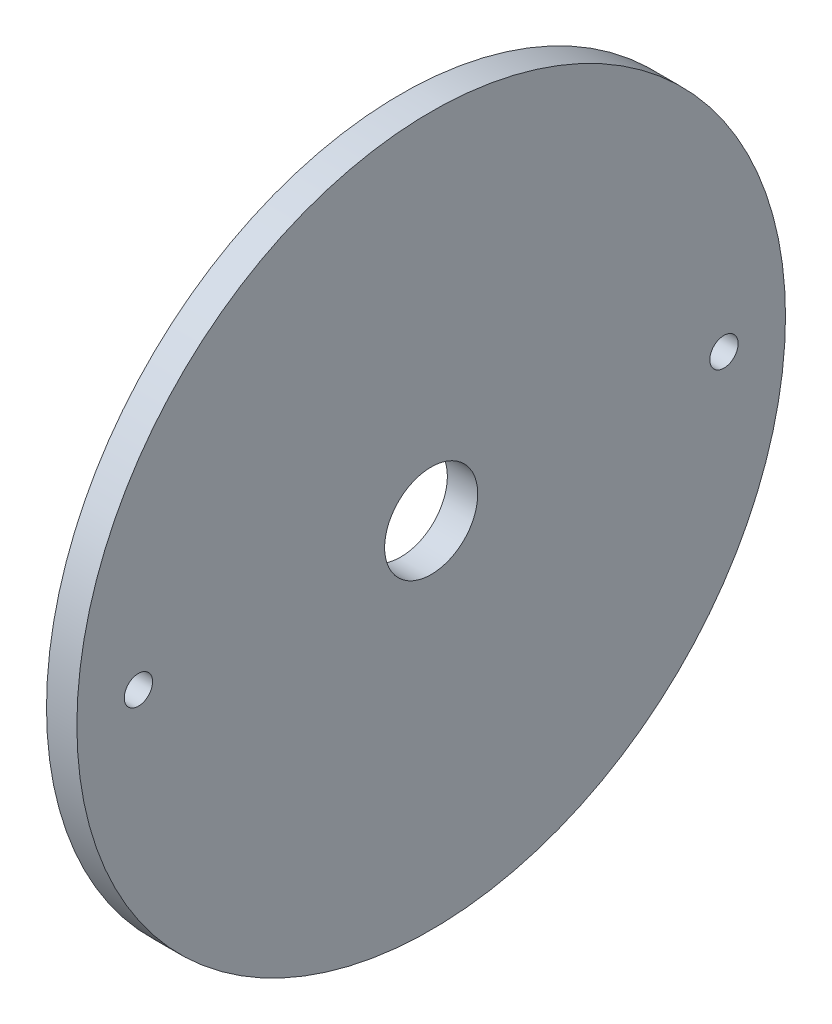
ISO-10303-21;
HEADER;
FILE_DESCRIPTION(('STEP AP214'),'2;1');
FILE_NAME('part.step','',(''),(''),'','','');
FILE_SCHEMA(('AUTOMOTIVE_DESIGN { 1 0 10303 214 1 1 1 1 }'));
ENDSEC;
DATA;
#1=APPLICATION_CONTEXT('core data for automotive mechanical design processes');
#2=APPLICATION_PROTOCOL_DEFINITION('international standard','automotive_design',2000,#1);
#3=PRODUCT_CONTEXT('',#1,'mechanical');
#4=PRODUCT('Part','Part','',(#3));
#5=PRODUCT_RELATED_PRODUCT_CATEGORY('part','',(#4));
#6=PRODUCT_DEFINITION_FORMATION('','',#4);
#7=PRODUCT_DEFINITION_CONTEXT('part definition',#1,'design');
#8=PRODUCT_DEFINITION('design','',#6,#7);
#9=PRODUCT_DEFINITION_SHAPE('','',#8);
#10=(LENGTH_UNIT() NAMED_UNIT(*) SI_UNIT(.MILLI.,.METRE.));
#11=(NAMED_UNIT(*) PLANE_ANGLE_UNIT() SI_UNIT($,.RADIAN.));
#12=(NAMED_UNIT(*) SI_UNIT($,.STERADIAN.) SOLID_ANGLE_UNIT());
#13=UNCERTAINTY_MEASURE_WITH_UNIT(LENGTH_MEASURE(1.E-05),#10,'distance_accuracy_value','');
#14=(GEOMETRIC_REPRESENTATION_CONTEXT(3) GLOBAL_UNCERTAINTY_ASSIGNED_CONTEXT((#13)) GLOBAL_UNIT_ASSIGNED_CONTEXT((#10,
#11,#12)) REPRESENTATION_CONTEXT('',''));
#15=CARTESIAN_POINT('',(0.,0.,0.));
#16=DIRECTION('',(0.,0.,1.));
#17=DIRECTION('',(1.,0.,0.));
#18=AXIS2_PLACEMENT_3D('',#15,#16,#17);
#19=CARTESIAN_POINT('',(1.5,0.,0.));
#20=DIRECTION('',(1.,0.,0.));
#21=DIRECTION('',(0.,0.,-1.));
#22=AXIS2_PLACEMENT_3D('',#19,#20,#21);
#23=PLANE('',#22);
#24=CARTESIAN_POINT('',(1.5,0.,-14.46));
#25=DIRECTION('',(1.,0.,0.));
#26=DIRECTION('',(0.,0.,-1.));
#27=AXIS2_PLACEMENT_3D('',#24,#25,#26);
#28=CIRCLE('',#27,0.7);
#29=CARTESIAN_POINT('',(1.5,0.,-15.16));
#30=VERTEX_POINT('',#29);
#31=EDGE_CURVE('E46',#30,#30,#28,.T.);
#32=ORIENTED_EDGE('',*,*,#31,.F.);
#33=EDGE_LOOP('',(#32));
#34=FACE_BOUND('',#33,.T.);
#35=CARTESIAN_POINT('',(1.5,0.,0.));
#36=DIRECTION('',(1.,0.,0.));
#37=DIRECTION('',(0.,0.,-1.));
#38=AXIS2_PLACEMENT_3D('',#35,#36,#37);
#39=CIRCLE('',#38,17.5);
#40=CARTESIAN_POINT('',(1.5,0.,-17.5));
#41=VERTEX_POINT('',#40);
#42=EDGE_CURVE('E10',#41,#41,#39,.T.);
#43=ORIENTED_EDGE('',*,*,#42,.T.);
#44=EDGE_LOOP('',(#43));
#45=FACE_BOUND('',#44,.T.);
#46=CARTESIAN_POINT('',(1.5,0.,0.));
#47=DIRECTION('',(1.,0.,0.));
#48=DIRECTION('',(0.,0.,-1.));
#49=AXIS2_PLACEMENT_3D('',#46,#47,#48);
#50=CIRCLE('',#49,2.3);
#51=CARTESIAN_POINT('',(1.5,0.,-2.3));
#52=VERTEX_POINT('',#51);
#53=EDGE_CURVE('E41',#52,#52,#50,.T.);
#54=ORIENTED_EDGE('',*,*,#53,.F.);
#55=EDGE_LOOP('',(#54));
#56=FACE_BOUND('',#55,.T.);
#57=CARTESIAN_POINT('',(1.5,0.,14.46));
#58=DIRECTION('',(1.,0.,0.));
#59=DIRECTION('',(0.,0.,-1.));
#60=AXIS2_PLACEMENT_3D('',#57,#58,#59);
#61=CIRCLE('',#60,0.7);
#62=CARTESIAN_POINT('',(1.5,0.,13.76));
#63=VERTEX_POINT('',#62);
#64=EDGE_CURVE('E52',#63,#63,#61,.T.);
#65=ORIENTED_EDGE('',*,*,#64,.F.);
#66=EDGE_LOOP('',(#65));
#67=FACE_BOUND('',#66,.T.);
#68=ADVANCED_FACE('F30',(#34,#45,#56,#67),#23,.T.);
#69=CARTESIAN_POINT('',(0.,0.,0.));
#70=DIRECTION('',(1.,0.,0.));
#71=DIRECTION('',(0.,0.,-1.));
#72=AXIS2_PLACEMENT_3D('',#69,#70,#71);
#73=PLANE('',#72);
#74=CARTESIAN_POINT('',(0.,0.,0.));
#75=DIRECTION('',(1.,0.,0.));
#76=DIRECTION('',(0.,0.,-1.));
#77=AXIS2_PLACEMENT_3D('',#74,#75,#76);
#78=CIRCLE('',#77,17.5);
#79=CARTESIAN_POINT('',(0.,0.,-17.5));
#80=VERTEX_POINT('',#79);
#81=EDGE_CURVE('E34',#80,#80,#78,.T.);
#82=ORIENTED_EDGE('',*,*,#81,.F.);
#83=EDGE_LOOP('',(#82));
#84=FACE_BOUND('',#83,.T.);
#85=CARTESIAN_POINT('',(0.,0.,0.));
#86=DIRECTION('',(1.,0.,0.));
#87=DIRECTION('',(0.,0.,-1.));
#88=AXIS2_PLACEMENT_3D('',#85,#86,#87);
#89=CIRCLE('',#88,2.3);
#90=CARTESIAN_POINT('',(0.,0.,-2.3));
#91=VERTEX_POINT('',#90);
#92=EDGE_CURVE('E43',#91,#91,#89,.T.);
#93=ORIENTED_EDGE('',*,*,#92,.T.);
#94=EDGE_LOOP('',(#93));
#95=FACE_BOUND('',#94,.T.);
#96=CARTESIAN_POINT('',(0.,0.,-14.46));
#97=DIRECTION('',(1.,0.,0.));
#98=DIRECTION('',(0.,0.,-1.));
#99=AXIS2_PLACEMENT_3D('',#96,#97,#98);
#100=CIRCLE('',#99,0.7);
#101=CARTESIAN_POINT('',(0.,0.,-15.16));
#102=VERTEX_POINT('',#101);
#103=EDGE_CURVE('E49',#102,#102,#100,.T.);
#104=ORIENTED_EDGE('',*,*,#103,.T.);
#105=EDGE_LOOP('',(#104));
#106=FACE_BOUND('',#105,.T.);
#107=CARTESIAN_POINT('',(0.,0.,14.46));
#108=DIRECTION('',(1.,0.,0.));
#109=DIRECTION('',(0.,0.,-1.));
#110=AXIS2_PLACEMENT_3D('',#107,#108,#109);
#111=CIRCLE('',#110,0.7);
#112=CARTESIAN_POINT('',(0.,0.,13.76));
#113=VERTEX_POINT('',#112);
#114=EDGE_CURVE('E55',#113,#113,#111,.T.);
#115=ORIENTED_EDGE('',*,*,#114,.T.);
#116=EDGE_LOOP('',(#115));
#117=FACE_BOUND('',#116,.T.);
#118=ADVANCED_FACE('F65',(#84,#95,#106,#117),#73,.F.);
#119=CARTESIAN_POINT('',(1.5,0.,0.));
#120=DIRECTION('',(-1.,0.,0.));
#121=DIRECTION('',(0.,0.,1.));
#122=AXIS2_PLACEMENT_3D('',#119,#120,#121);
#123=CYLINDRICAL_SURFACE('',#122,17.5);
#124=ORIENTED_EDGE('',*,*,#42,.F.);
#125=EDGE_LOOP('',(#124));
#126=FACE_BOUND('',#125,.T.);
#127=ORIENTED_EDGE('',*,*,#81,.T.);
#128=EDGE_LOOP('',(#127));
#129=FACE_BOUND('',#128,.T.);
#130=ADVANCED_FACE('F32',(#126,#129),#123,.T.);
#131=CARTESIAN_POINT('',(1.5,0.,0.));
#132=DIRECTION('',(-1.,0.,0.));
#133=DIRECTION('',(0.,0.,1.));
#134=AXIS2_PLACEMENT_3D('',#131,#132,#133);
#135=CYLINDRICAL_SURFACE('',#134,2.3);
#136=ORIENTED_EDGE('',*,*,#53,.T.);
#137=EDGE_LOOP('',(#136));
#138=FACE_BOUND('',#137,.T.);
#139=ORIENTED_EDGE('',*,*,#92,.F.);
#140=EDGE_LOOP('',(#139));
#141=FACE_BOUND('',#140,.T.);
#142=ADVANCED_FACE('F74',(#138,#141),#135,.F.);
#143=CARTESIAN_POINT('',(1.5,0.,-14.46));
#144=DIRECTION('',(-1.,0.,0.));
#145=DIRECTION('',(0.,0.,1.));
#146=AXIS2_PLACEMENT_3D('',#143,#144,#145);
#147=CYLINDRICAL_SURFACE('',#146,0.7);
#148=ORIENTED_EDGE('',*,*,#31,.T.);
#149=EDGE_LOOP('',(#148));
#150=FACE_BOUND('',#149,.T.);
#151=ORIENTED_EDGE('',*,*,#103,.F.);
#152=EDGE_LOOP('',(#151));
#153=FACE_BOUND('',#152,.T.);
#154=ADVANCED_FACE('F77',(#150,#153),#147,.F.);
#155=CARTESIAN_POINT('',(1.5,0.,14.46));
#156=DIRECTION('',(-1.,0.,0.));
#157=DIRECTION('',(0.,0.,1.));
#158=AXIS2_PLACEMENT_3D('',#155,#156,#157);
#159=CYLINDRICAL_SURFACE('',#158,0.7);
#160=ORIENTED_EDGE('',*,*,#64,.T.);
#161=EDGE_LOOP('',(#160));
#162=FACE_BOUND('',#161,.T.);
#163=ORIENTED_EDGE('',*,*,#114,.F.);
#164=EDGE_LOOP('',(#163));
#165=FACE_BOUND('',#164,.T.);
#166=ADVANCED_FACE('F61',(#162,#165),#159,.F.);
#167=CLOSED_SHELL('',(#68,#118,#130,#142,#154,#166));
#168=MANIFOLD_SOLID_BREP('B2',#167);
#169=ADVANCED_BREP_SHAPE_REPRESENTATION('',(#18,#168),#14);
#170=SHAPE_DEFINITION_REPRESENTATION(#9,#169);
ENDSEC;
END-ISO-10303-21;
